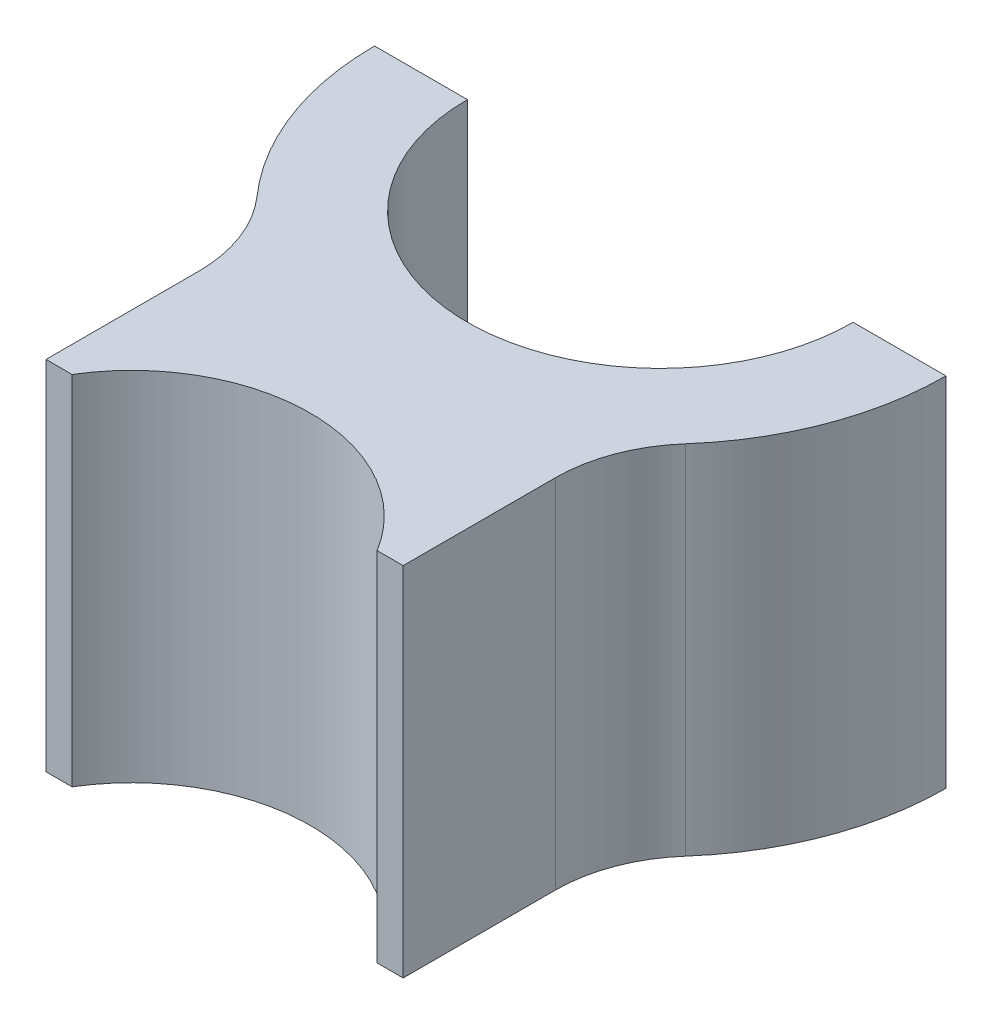
ISO-10303-21;
HEADER;
FILE_DESCRIPTION(('STEP AP214'),'2;1');
FILE_NAME('part.step','',(''),(''),'','','');
FILE_SCHEMA(('AUTOMOTIVE_DESIGN { 1 0 10303 214 1 1 1 1 }'));
ENDSEC;
DATA;
#1=APPLICATION_CONTEXT('core data for automotive mechanical design processes');
#2=APPLICATION_PROTOCOL_DEFINITION('international standard','automotive_design',2000,#1);
#3=PRODUCT_CONTEXT('',#1,'mechanical');
#4=PRODUCT('Part','Part','',(#3));
#5=PRODUCT_RELATED_PRODUCT_CATEGORY('part','',(#4));
#6=PRODUCT_DEFINITION_FORMATION('','',#4);
#7=PRODUCT_DEFINITION_CONTEXT('part definition',#1,'design');
#8=PRODUCT_DEFINITION('design','',#6,#7);
#9=PRODUCT_DEFINITION_SHAPE('','',#8);
#10=(LENGTH_UNIT() NAMED_UNIT(*) SI_UNIT(.MILLI.,.METRE.));
#11=(NAMED_UNIT(*) PLANE_ANGLE_UNIT() SI_UNIT($,.RADIAN.));
#12=(NAMED_UNIT(*) SI_UNIT($,.STERADIAN.) SOLID_ANGLE_UNIT());
#13=UNCERTAINTY_MEASURE_WITH_UNIT(LENGTH_MEASURE(1.E-05),#10,'distance_accuracy_value','');
#14=(GEOMETRIC_REPRESENTATION_CONTEXT(3) GLOBAL_UNCERTAINTY_ASSIGNED_CONTEXT((#13)) GLOBAL_UNIT_ASSIGNED_CONTEXT((#10,
#11,#12)) REPRESENTATION_CONTEXT('',''));
#15=CARTESIAN_POINT('',(0.,0.,0.));
#16=DIRECTION('',(0.,0.,1.));
#17=DIRECTION('',(1.,0.,0.));
#18=AXIS2_PLACEMENT_3D('',#15,#16,#17);
#19=CARTESIAN_POINT('',(22.5,25.,19.8431348329844));
#20=DIRECTION('',(0.,-1.,0.));
#21=DIRECTION('',(0.,0.,-1.));
#22=AXIS2_PLACEMENT_3D('',#19,#20,#21);
#23=CYLINDRICAL_SURFACE('',#22,10.);
#24=CARTESIAN_POINT('',(22.5,0.,19.8431348329844));
#25=DIRECTION('',(0.,-1.,0.));
#26=DIRECTION('',(0.,0.,-1.));
#27=AXIS2_PLACEMENT_3D('',#24,#25,#26);
#28=CIRCLE('',#27,10.);
#29=CARTESIAN_POINT('',(12.5,0.,19.8431348329844));
#30=VERTEX_POINT('',#29);
#31=CARTESIAN_POINT('',(15.,0.,13.228756555323));
#32=VERTEX_POINT('',#31);
#33=EDGE_CURVE('E151',#30,#32,#28,.T.);
#34=ORIENTED_EDGE('',*,*,#33,.T.);
#35=DIRECTION('',(0.,-1.,0.));
#36=VECTOR('',#35,1.);
#37=CARTESIAN_POINT('',(15.,25.,13.228756555323));
#38=LINE('',#37,#36);
#39=CARTESIAN_POINT('',(15.,25.,13.228756555323));
#40=VERTEX_POINT('',#39);
#41=EDGE_CURVE('E191',#40,#32,#38,.T.);
#42=ORIENTED_EDGE('',*,*,#41,.F.);
#43=CARTESIAN_POINT('',(22.5,25.,19.8431348329844));
#44=DIRECTION('',(0.,-1.,0.));
#45=DIRECTION('',(0.,0.,-1.));
#46=AXIS2_PLACEMENT_3D('',#43,#44,#45);
#47=CIRCLE('',#46,10.);
#48=CARTESIAN_POINT('',(12.5,25.,19.8431348329844));
#49=VERTEX_POINT('',#48);
#50=EDGE_CURVE('E173',#49,#40,#47,.T.);
#51=ORIENTED_EDGE('',*,*,#50,.F.);
#52=DIRECTION('',(0.,-1.,0.));
#53=VECTOR('',#52,1.);
#54=CARTESIAN_POINT('',(12.5,25.,19.8431348329844));
#55=LINE('',#54,#53);
#56=EDGE_CURVE('E142',#49,#30,#55,.T.);
#57=ORIENTED_EDGE('',*,*,#56,.T.);
#58=EDGE_LOOP('',(#34,#42,#51,#57));
#59=FACE_BOUND('',#58,.T.);
#60=ADVANCED_FACE('F34',(#59),#23,.F.);
#61=CARTESIAN_POINT('',(0.,25.,0.));
#62=DIRECTION('',(0.,-1.,0.));
#63=DIRECTION('',(0.,0.,-1.));
#64=AXIS2_PLACEMENT_3D('',#61,#62,#63);
#65=CYLINDRICAL_SURFACE('',#64,20.);
#66=CARTESIAN_POINT('',(0.,0.,0.));
#67=DIRECTION('',(0.,1.,0.));
#68=DIRECTION('',(0.,0.,1.));
#69=AXIS2_PLACEMENT_3D('',#66,#67,#68);
#70=CIRCLE('',#69,20.);
#71=CARTESIAN_POINT('',(20.,0.,0.));
#72=VERTEX_POINT('',#71);
#73=EDGE_CURVE('E154',#32,#72,#70,.T.);
#74=ORIENTED_EDGE('',*,*,#73,.T.);
#75=DIRECTION('',(0.,-1.,0.));
#76=VECTOR('',#75,1.);
#77=CARTESIAN_POINT('',(20.,25.,0.));
#78=LINE('',#77,#76);
#79=CARTESIAN_POINT('',(20.,25.,0.));
#80=VERTEX_POINT('',#79);
#81=EDGE_CURVE('E189',#80,#72,#78,.T.);
#82=ORIENTED_EDGE('',*,*,#81,.F.);
#83=CARTESIAN_POINT('',(0.,25.,0.));
#84=DIRECTION('',(0.,1.,0.));
#85=DIRECTION('',(0.,0.,1.));
#86=AXIS2_PLACEMENT_3D('',#83,#84,#85);
#87=CIRCLE('',#86,20.);
#88=EDGE_CURVE('E197',#40,#80,#87,.T.);
#89=ORIENTED_EDGE('',*,*,#88,.F.);
#90=ORIENTED_EDGE('',*,*,#41,.T.);
#91=EDGE_LOOP('',(#74,#82,#89,#90));
#92=FACE_BOUND('',#91,.T.);
#93=ADVANCED_FACE('F195',(#92),#65,.T.);
#94=CARTESIAN_POINT('',(13.5,25.,0.));
#95=DIRECTION('',(0.,0.,1.));
#96=DIRECTION('',(1.,0.,0.));
#97=AXIS2_PLACEMENT_3D('',#94,#95,#96);
#98=PLANE('',#97);
#99=DIRECTION('',(-1.,0.,0.));
#100=VECTOR('',#99,1.);
#101=CARTESIAN_POINT('',(13.5,0.,0.));
#102=LINE('',#101,#100);
#103=CARTESIAN_POINT('',(13.5,0.,0.));
#104=VERTEX_POINT('',#103);
#105=EDGE_CURVE('E156',#72,#104,#102,.T.);
#106=ORIENTED_EDGE('',*,*,#105,.T.);
#107=DIRECTION('',(0.,-1.,0.));
#108=VECTOR('',#107,1.);
#109=CARTESIAN_POINT('',(13.5,25.,0.));
#110=LINE('',#109,#108);
#111=CARTESIAN_POINT('',(13.5,25.,0.));
#112=VERTEX_POINT('',#111);
#113=EDGE_CURVE('E186',#112,#104,#110,.T.);
#114=ORIENTED_EDGE('',*,*,#113,.F.);
#115=DIRECTION('',(-1.,0.,0.));
#116=VECTOR('',#115,1.);
#117=CARTESIAN_POINT('',(13.5,25.,0.));
#118=LINE('',#117,#116);
#119=EDGE_CURVE('E216',#80,#112,#118,.T.);
#120=ORIENTED_EDGE('',*,*,#119,.F.);
#121=ORIENTED_EDGE('',*,*,#81,.T.);
#122=EDGE_LOOP('',(#106,#114,#120,#121));
#123=FACE_BOUND('',#122,.T.);
#124=ADVANCED_FACE('F207',(#123),#98,.F.);
#125=CARTESIAN_POINT('',(0.,25.,0.));
#126=DIRECTION('',(0.,-1.,0.));
#127=DIRECTION('',(0.,0.,-1.));
#128=AXIS2_PLACEMENT_3D('',#125,#126,#127);
#129=CYLINDRICAL_SURFACE('',#128,13.5);
#130=CARTESIAN_POINT('',(0.,0.,0.));
#131=DIRECTION('',(0.,-1.,0.));
#132=DIRECTION('',(0.,0.,1.));
#133=AXIS2_PLACEMENT_3D('',#130,#131,#132);
#134=CIRCLE('',#133,13.5);
#135=CARTESIAN_POINT('',(-13.5,0.,0.));
#136=VERTEX_POINT('',#135);
#137=EDGE_CURVE('E158',#104,#136,#134,.T.);
#138=ORIENTED_EDGE('',*,*,#137,.T.);
#139=DIRECTION('',(0.,-1.,0.));
#140=VECTOR('',#139,1.);
#141=CARTESIAN_POINT('',(-13.5,25.,0.));
#142=LINE('',#141,#140);
#143=CARTESIAN_POINT('',(-13.5,25.,0.));
#144=VERTEX_POINT('',#143);
#145=EDGE_CURVE('E183',#144,#136,#142,.T.);
#146=ORIENTED_EDGE('',*,*,#145,.F.);
#147=CARTESIAN_POINT('',(0.,25.,0.));
#148=DIRECTION('',(0.,-1.,0.));
#149=DIRECTION('',(0.,0.,1.));
#150=AXIS2_PLACEMENT_3D('',#147,#148,#149);
#151=CIRCLE('',#150,13.5);
#152=EDGE_CURVE('E213',#112,#144,#151,.T.);
#153=ORIENTED_EDGE('',*,*,#152,.F.);
#154=ORIENTED_EDGE('',*,*,#113,.T.);
#155=EDGE_LOOP('',(#138,#146,#153,#154));
#156=FACE_BOUND('',#155,.T.);
#157=ADVANCED_FACE('F211',(#156),#129,.F.);
#158=CARTESIAN_POINT('',(-13.5,25.,0.));
#159=DIRECTION('',(0.,0.,1.));
#160=DIRECTION('',(1.,0.,0.));
#161=AXIS2_PLACEMENT_3D('',#158,#159,#160);
#162=PLANE('',#161);
#163=DIRECTION('',(-1.,0.,0.));
#164=VECTOR('',#163,1.);
#165=CARTESIAN_POINT('',(-13.5,0.,0.));
#166=LINE('',#165,#164);
#167=CARTESIAN_POINT('',(-20.,0.,0.));
#168=VERTEX_POINT('',#167);
#169=EDGE_CURVE('E160',#136,#168,#166,.T.);
#170=ORIENTED_EDGE('',*,*,#169,.T.);
#171=DIRECTION('',(0.,-1.,0.));
#172=VECTOR('',#171,1.);
#173=CARTESIAN_POINT('',(-20.,25.,0.));
#174=LINE('',#173,#172);
#175=CARTESIAN_POINT('',(-20.,25.,0.));
#176=VERTEX_POINT('',#175);
#177=EDGE_CURVE('E180',#176,#168,#174,.T.);
#178=ORIENTED_EDGE('',*,*,#177,.F.);
#179=DIRECTION('',(-1.,0.,0.));
#180=VECTOR('',#179,1.);
#181=CARTESIAN_POINT('',(-13.5,25.,0.));
#182=LINE('',#181,#180);
#183=EDGE_CURVE('E215',#144,#176,#182,.T.);
#184=ORIENTED_EDGE('',*,*,#183,.F.);
#185=ORIENTED_EDGE('',*,*,#145,.T.);
#186=EDGE_LOOP('',(#170,#178,#184,#185));
#187=FACE_BOUND('',#186,.T.);
#188=ADVANCED_FACE('F250',(#187),#162,.F.);
#189=CARTESIAN_POINT('',(0.,25.,0.));
#190=DIRECTION('',(0.,-1.,0.));
#191=DIRECTION('',(0.,0.,-1.));
#192=AXIS2_PLACEMENT_3D('',#189,#190,#191);
#193=CYLINDRICAL_SURFACE('',#192,20.);
#194=CARTESIAN_POINT('',(0.,0.,0.));
#195=DIRECTION('',(0.,1.,0.));
#196=DIRECTION('',(0.,0.,1.));
#197=AXIS2_PLACEMENT_3D('',#194,#195,#196);
#198=CIRCLE('',#197,20.);
#199=CARTESIAN_POINT('',(-15.,0.,13.228756555323));
#200=VERTEX_POINT('',#199);
#201=EDGE_CURVE('E162',#168,#200,#198,.T.);
#202=ORIENTED_EDGE('',*,*,#201,.T.);
#203=DIRECTION('',(0.,-1.,0.));
#204=VECTOR('',#203,1.);
#205=CARTESIAN_POINT('',(-15.,25.,13.228756555323));
#206=LINE('',#205,#204);
#207=CARTESIAN_POINT('',(-15.,25.,13.228756555323));
#208=VERTEX_POINT('',#207);
#209=EDGE_CURVE('E177',#208,#200,#206,.T.);
#210=ORIENTED_EDGE('',*,*,#209,.F.);
#211=CARTESIAN_POINT('',(0.,25.,0.));
#212=DIRECTION('',(0.,1.,0.));
#213=DIRECTION('',(0.,0.,1.));
#214=AXIS2_PLACEMENT_3D('',#211,#212,#213);
#215=CIRCLE('',#214,20.);
#216=EDGE_CURVE('E218',#176,#208,#215,.T.);
#217=ORIENTED_EDGE('',*,*,#216,.F.);
#218=ORIENTED_EDGE('',*,*,#177,.T.);
#219=EDGE_LOOP('',(#202,#210,#217,#218));
#220=FACE_BOUND('',#219,.T.);
#221=ADVANCED_FACE('F247',(#220),#193,.T.);
#222=CARTESIAN_POINT('',(-22.5,25.,19.8431348329844));
#223=DIRECTION('',(0.,-1.,0.));
#224=DIRECTION('',(0.,0.,-1.));
#225=AXIS2_PLACEMENT_3D('',#222,#223,#224);
#226=CYLINDRICAL_SURFACE('',#225,10.);
#227=CARTESIAN_POINT('',(-22.5,0.,19.8431348329844));
#228=DIRECTION('',(0.,-1.,0.));
#229=DIRECTION('',(0.,0.,1.));
#230=AXIS2_PLACEMENT_3D('',#227,#228,#229);
#231=CIRCLE('',#230,10.);
#232=CARTESIAN_POINT('',(-12.5,0.,19.8431348329844));
#233=VERTEX_POINT('',#232);
#234=EDGE_CURVE('E164',#200,#233,#231,.T.);
#235=ORIENTED_EDGE('',*,*,#234,.T.);
#236=DIRECTION('',(0.,-1.,0.));
#237=VECTOR('',#236,1.);
#238=CARTESIAN_POINT('',(-12.5,25.,19.8431348329844));
#239=LINE('',#238,#237);
#240=CARTESIAN_POINT('',(-12.5,25.,19.8431348329844));
#241=VERTEX_POINT('',#240);
#242=EDGE_CURVE('E145',#241,#233,#239,.T.);
#243=ORIENTED_EDGE('',*,*,#242,.F.);
#244=CARTESIAN_POINT('',(-22.5,25.,19.8431348329844));
#245=DIRECTION('',(0.,-1.,0.));
#246=DIRECTION('',(0.,0.,1.));
#247=AXIS2_PLACEMENT_3D('',#244,#245,#246);
#248=CIRCLE('',#247,10.);
#249=EDGE_CURVE('E224',#208,#241,#248,.T.);
#250=ORIENTED_EDGE('',*,*,#249,.F.);
#251=ORIENTED_EDGE('',*,*,#209,.T.);
#252=EDGE_LOOP('',(#235,#243,#250,#251));
#253=FACE_BOUND('',#252,.T.);
#254=ADVANCED_FACE('F243',(#253),#226,.F.);
#255=CARTESIAN_POINT('',(-12.5,25.,37.));
#256=DIRECTION('',(1.,0.,0.));
#257=DIRECTION('',(0.,0.,-1.));
#258=AXIS2_PLACEMENT_3D('',#255,#256,#257);
#259=PLANE('',#258);
#260=DIRECTION('',(0.,0.,1.));
#261=VECTOR('',#260,1.);
#262=CARTESIAN_POINT('',(-12.5,0.,37.));
#263=LINE('',#262,#261);
#264=CARTESIAN_POINT('',(-12.5,0.,30.5));
#265=VERTEX_POINT('',#264);
#266=EDGE_CURVE('E166',#233,#265,#263,.T.);
#267=ORIENTED_EDGE('',*,*,#266,.T.);
#268=DIRECTION('',(0.,1.,0.));
#269=VECTOR('',#268,1.);
#270=CARTESIAN_POINT('',(-12.5,25.,30.5));
#271=LINE('',#270,#269);
#272=CARTESIAN_POINT('',(-12.5,25.,30.5));
#273=VERTEX_POINT('',#272);
#274=EDGE_CURVE('E47',#265,#273,#271,.T.);
#275=ORIENTED_EDGE('',*,*,#274,.T.);
#276=DIRECTION('',(0.,0.,1.));
#277=VECTOR('',#276,1.);
#278=CARTESIAN_POINT('',(-12.5,25.,37.));
#279=LINE('',#278,#277);
#280=EDGE_CURVE('E147',#241,#273,#279,.T.);
#281=ORIENTED_EDGE('',*,*,#280,.F.);
#282=ORIENTED_EDGE('',*,*,#242,.T.);
#283=EDGE_LOOP('',(#267,#275,#281,#282));
#284=FACE_BOUND('',#283,.T.);
#285=ADVANCED_FACE('F229',(#284),#259,.F.);
#286=CARTESIAN_POINT('',(0.,25.,37.));
#287=DIRECTION('',(0.,-1.,0.));
#288=DIRECTION('',(0.,0.,-1.));
#289=AXIS2_PLACEMENT_3D('',#286,#287,#288);
#290=CYLINDRICAL_SURFACE('',#289,12.5);
#291=CARTESIAN_POINT('',(0.,0.,37.));
#292=DIRECTION('',(0.,-1.,0.));
#293=DIRECTION('',(0.,0.,1.));
#294=AXIS2_PLACEMENT_3D('',#291,#292,#293);
#295=CIRCLE('',#294,12.5);
#296=CARTESIAN_POINT('',(-10.6770782520313,0.,30.5));
#297=VERTEX_POINT('',#296);
#298=CARTESIAN_POINT('',(10.6770782520313,0.,30.5));
#299=VERTEX_POINT('',#298);
#300=EDGE_CURVE('E169',#297,#299,#295,.T.);
#301=ORIENTED_EDGE('',*,*,#300,.T.);
#302=DIRECTION('',(0.,-1.,0.));
#303=VECTOR('',#302,1.);
#304=CARTESIAN_POINT('',(10.6770782520313,25.,30.5));
#305=LINE('',#304,#303);
#306=CARTESIAN_POINT('',(10.6770782520313,25.,30.5));
#307=VERTEX_POINT('',#306);
#308=EDGE_CURVE('E55',#299,#307,#305,.F.);
#309=ORIENTED_EDGE('',*,*,#308,.T.);
#310=CARTESIAN_POINT('',(0.,25.,37.));
#311=DIRECTION('',(0.,-1.,0.));
#312=DIRECTION('',(0.,0.,1.));
#313=AXIS2_PLACEMENT_3D('',#310,#311,#312);
#314=CIRCLE('',#313,12.5);
#315=CARTESIAN_POINT('',(-10.6770782520313,25.,30.5));
#316=VERTEX_POINT('',#315);
#317=EDGE_CURVE('E137',#316,#307,#314,.T.);
#318=ORIENTED_EDGE('',*,*,#317,.F.);
#319=DIRECTION('',(0.,-1.,0.));
#320=VECTOR('',#319,1.);
#321=CARTESIAN_POINT('',(-10.6770782520313,25.,30.5));
#322=LINE('',#321,#320);
#323=EDGE_CURVE('E126',#316,#297,#322,.T.);
#324=ORIENTED_EDGE('',*,*,#323,.T.);
#325=EDGE_LOOP('',(#301,#309,#318,#324));
#326=FACE_BOUND('',#325,.T.);
#327=ADVANCED_FACE('F239',(#326),#290,.F.);
#328=CARTESIAN_POINT('',(12.5,25.,37.));
#329=DIRECTION('',(-1.,0.,0.));
#330=DIRECTION('',(0.,0.,1.));
#331=AXIS2_PLACEMENT_3D('',#328,#329,#330);
#332=PLANE('',#331);
#333=DIRECTION('',(0.,0.,-1.));
#334=VECTOR('',#333,1.);
#335=CARTESIAN_POINT('',(12.5,25.,37.));
#336=LINE('',#335,#334);
#337=CARTESIAN_POINT('',(12.5,25.,30.5));
#338=VERTEX_POINT('',#337);
#339=EDGE_CURVE('E133',#338,#49,#336,.T.);
#340=ORIENTED_EDGE('',*,*,#339,.F.);
#341=DIRECTION('',(0.,-1.,0.));
#342=VECTOR('',#341,1.);
#343=CARTESIAN_POINT('',(12.5,25.,30.5));
#344=LINE('',#343,#342);
#345=CARTESIAN_POINT('',(12.5,0.,30.5));
#346=VERTEX_POINT('',#345);
#347=EDGE_CURVE('E119',#338,#346,#344,.T.);
#348=ORIENTED_EDGE('',*,*,#347,.T.);
#349=DIRECTION('',(0.,0.,-1.));
#350=VECTOR('',#349,1.);
#351=CARTESIAN_POINT('',(12.5,0.,37.));
#352=LINE('',#351,#350);
#353=EDGE_CURVE('E172',#346,#30,#352,.T.);
#354=ORIENTED_EDGE('',*,*,#353,.T.);
#355=ORIENTED_EDGE('',*,*,#56,.F.);
#356=EDGE_LOOP('',(#340,#348,#354,#355));
#357=FACE_BOUND('',#356,.T.);
#358=ADVANCED_FACE('F140',(#357),#332,.F.);
#359=CARTESIAN_POINT('',(22.5,25.,19.8431348329844));
#360=DIRECTION('',(0.,-1.,0.));
#361=DIRECTION('',(0.,0.,-1.));
#362=AXIS2_PLACEMENT_3D('',#359,#360,#361);
#363=PLANE('',#362);
#364=ORIENTED_EDGE('',*,*,#280,.T.);
#365=DIRECTION('',(-1.,0.,0.));
#366=VECTOR('',#365,1.);
#367=CARTESIAN_POINT('',(-13.7482403924225,25.,30.5));
#368=LINE('',#367,#366);
#369=EDGE_CURVE('E138',#316,#273,#368,.T.);
#370=ORIENTED_EDGE('',*,*,#369,.F.);
#371=ORIENTED_EDGE('',*,*,#317,.T.);
#372=EDGE_CURVE('E122',#338,#307,#368,.T.);
#373=ORIENTED_EDGE('',*,*,#372,.F.);
#374=ORIENTED_EDGE('',*,*,#339,.T.);
#375=ORIENTED_EDGE('',*,*,#50,.T.);
#376=ORIENTED_EDGE('',*,*,#88,.T.);
#377=ORIENTED_EDGE('',*,*,#119,.T.);
#378=ORIENTED_EDGE('',*,*,#152,.T.);
#379=ORIENTED_EDGE('',*,*,#183,.T.);
#380=ORIENTED_EDGE('',*,*,#216,.T.);
#381=ORIENTED_EDGE('',*,*,#249,.T.);
#382=EDGE_LOOP('',(#364,#370,#371,#373,#374,#375,#376,#377,#378,#379,#380,#381));
#383=FACE_BOUND('',#382,.T.);
#384=ADVANCED_FACE('F131',(#383),#363,.F.);
#385=CARTESIAN_POINT('',(22.5,0.,19.8431348329844));
#386=DIRECTION('',(0.,-1.,0.));
#387=DIRECTION('',(0.,0.,-1.));
#388=AXIS2_PLACEMENT_3D('',#385,#386,#387);
#389=PLANE('',#388);
#390=DIRECTION('',(1.,0.,0.));
#391=VECTOR('',#390,1.);
#392=CARTESIAN_POINT('',(22.5,0.,30.5));
#393=LINE('',#392,#391);
#394=EDGE_CURVE('E11',#265,#297,#393,.T.);
#395=ORIENTED_EDGE('',*,*,#394,.F.);
#396=ORIENTED_EDGE('',*,*,#266,.F.);
#397=ORIENTED_EDGE('',*,*,#234,.F.);
#398=ORIENTED_EDGE('',*,*,#201,.F.);
#399=ORIENTED_EDGE('',*,*,#169,.F.);
#400=ORIENTED_EDGE('',*,*,#137,.F.);
#401=ORIENTED_EDGE('',*,*,#105,.F.);
#402=ORIENTED_EDGE('',*,*,#73,.F.);
#403=ORIENTED_EDGE('',*,*,#33,.F.);
#404=ORIENTED_EDGE('',*,*,#353,.F.);
#405=EDGE_CURVE('E37',#299,#346,#393,.T.);
#406=ORIENTED_EDGE('',*,*,#405,.F.);
#407=ORIENTED_EDGE('',*,*,#300,.F.);
#408=EDGE_LOOP('',(#395,#396,#397,#398,#399,#400,#401,#402,#403,#404,#406,#407));
#409=FACE_BOUND('',#408,.T.);
#410=ADVANCED_FACE('F201',(#409),#389,.T.);
#411=CARTESIAN_POINT('',(-13.7482403924225,0.,30.5));
#412=DIRECTION('',(0.,0.,-1.));
#413=DIRECTION('',(-1.,0.,0.));
#414=AXIS2_PLACEMENT_3D('',#411,#412,#413);
#415=PLANE('',#414);
#416=ORIENTED_EDGE('',*,*,#405,.T.);
#417=ORIENTED_EDGE('',*,*,#347,.F.);
#418=ORIENTED_EDGE('',*,*,#372,.T.);
#419=ORIENTED_EDGE('',*,*,#308,.F.);
#420=EDGE_LOOP('',(#416,#417,#418,#419));
#421=FACE_BOUND('',#420,.T.);
#422=ADVANCED_FACE('F121',(#421),#415,.F.);
#423=ORIENTED_EDGE('',*,*,#394,.T.);
#424=ORIENTED_EDGE('',*,*,#323,.F.);
#425=ORIENTED_EDGE('',*,*,#369,.T.);
#426=ORIENTED_EDGE('',*,*,#274,.F.);
#427=EDGE_LOOP('',(#423,#424,#425,#426));
#428=FACE_BOUND('',#427,.T.);
#429=ADVANCED_FACE('F236',(#428),#415,.F.);
#430=CLOSED_SHELL('',(#60,#93,#124,#157,#188,#221,#254,#285,#327,#358,#384,#410,#422,#429));
#431=MANIFOLD_SOLID_BREP('B2',#430);
#432=ADVANCED_BREP_SHAPE_REPRESENTATION('',(#18,#431),#14);
#433=SHAPE_DEFINITION_REPRESENTATION(#9,#432);
ENDSEC;
END-ISO-10303-21;
